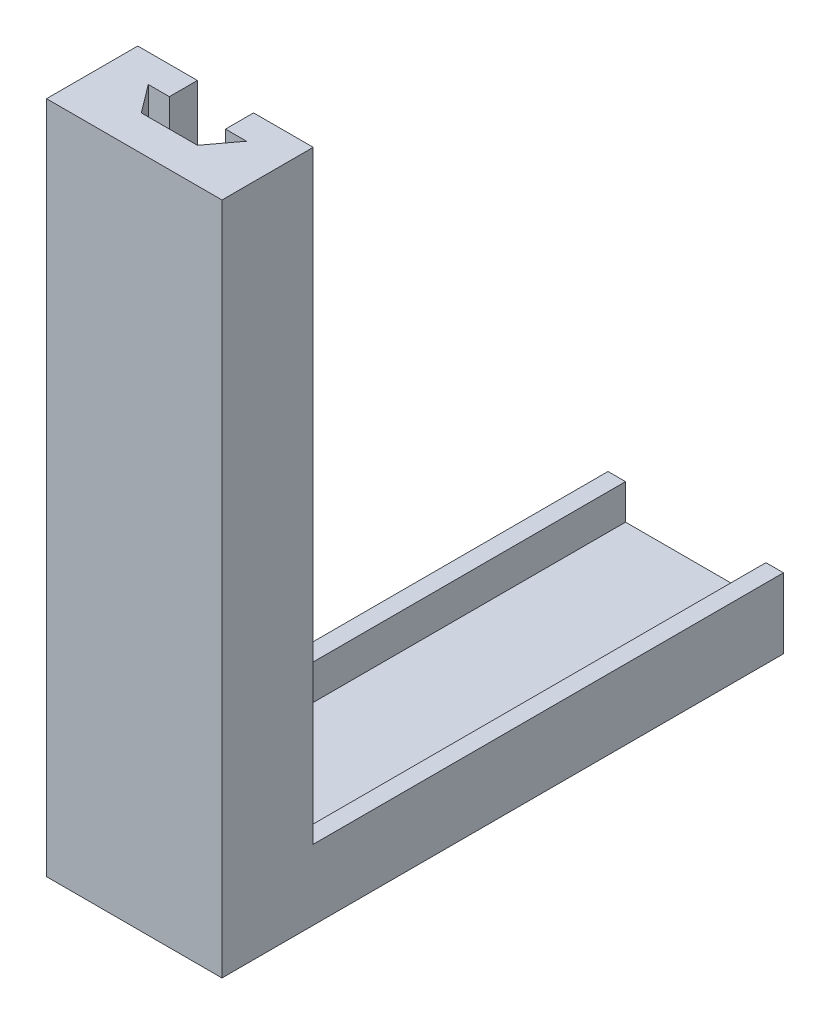
ISO-10303-21;
HEADER;
FILE_DESCRIPTION(('STEP AP214'),'2;1');
FILE_NAME('part.step','',(''),(''),'','','');
FILE_SCHEMA(('AUTOMOTIVE_DESIGN { 1 0 10303 214 1 1 1 1 }'));
ENDSEC;
DATA;
#1=APPLICATION_CONTEXT('core data for automotive mechanical design processes');
#2=APPLICATION_PROTOCOL_DEFINITION('international standard','automotive_design',2000,#1);
#3=PRODUCT_CONTEXT('',#1,'mechanical');
#4=PRODUCT('Part','Part','',(#3));
#5=PRODUCT_RELATED_PRODUCT_CATEGORY('part','',(#4));
#6=PRODUCT_DEFINITION_FORMATION('','',#4);
#7=PRODUCT_DEFINITION_CONTEXT('part definition',#1,'design');
#8=PRODUCT_DEFINITION('design','',#6,#7);
#9=PRODUCT_DEFINITION_SHAPE('','',#8);
#10=(LENGTH_UNIT() NAMED_UNIT(*) SI_UNIT(.MILLI.,.METRE.));
#11=(NAMED_UNIT(*) PLANE_ANGLE_UNIT() SI_UNIT($,.RADIAN.));
#12=(NAMED_UNIT(*) SI_UNIT($,.STERADIAN.) SOLID_ANGLE_UNIT());
#13=UNCERTAINTY_MEASURE_WITH_UNIT(LENGTH_MEASURE(1.E-05),#10,'distance_accuracy_value','');
#14=(GEOMETRIC_REPRESENTATION_CONTEXT(3) GLOBAL_UNCERTAINTY_ASSIGNED_CONTEXT((#13)) GLOBAL_UNIT_ASSIGNED_CONTEXT((#10,
#11,#12)) REPRESENTATION_CONTEXT('',''));
#15=CARTESIAN_POINT('',(0.,0.,0.));
#16=DIRECTION('',(0.,0.,1.));
#17=DIRECTION('',(1.,0.,0.));
#18=AXIS2_PLACEMENT_3D('',#15,#16,#17);
#19=CARTESIAN_POINT('',(0.,10.,0.));
#20=DIRECTION('',(0.,-1.,0.));
#21=DIRECTION('',(0.,0.,-1.));
#22=AXIS2_PLACEMENT_3D('',#19,#20,#21);
#23=PLANE('',#22);
#24=DIRECTION('',(1.,0.,0.));
#25=VECTOR('',#24,1.);
#26=CARTESIAN_POINT('',(-12.5,10.,27.));
#27=LINE('',#26,#25);
#28=CARTESIAN_POINT('',(-12.5,10.,27.));
#29=VERTEX_POINT('',#28);
#30=CARTESIAN_POINT('',(-9.99999999999999,10.,27.));
#31=VERTEX_POINT('',#30);
#32=EDGE_CURVE('E305',#29,#31,#27,.T.);
#33=ORIENTED_EDGE('',*,*,#32,.T.);
#34=DIRECTION('',(0.,0.,1.));
#35=VECTOR('',#34,1.);
#36=CARTESIAN_POINT('',(-10.,10.,-40.));
#37=LINE('',#36,#35);
#38=CARTESIAN_POINT('',(-10.,10.,-40.));
#39=VERTEX_POINT('',#38);
#40=EDGE_CURVE('E178',#39,#31,#37,.T.);
#41=ORIENTED_EDGE('',*,*,#40,.F.);
#42=DIRECTION('',(-1.,0.,0.));
#43=VECTOR('',#42,1.);
#44=CARTESIAN_POINT('',(-12.5,10.,-40.));
#45=LINE('',#44,#43);
#46=CARTESIAN_POINT('',(-12.5,10.,-40.));
#47=VERTEX_POINT('',#46);
#48=EDGE_CURVE('E329',#39,#47,#45,.T.);
#49=ORIENTED_EDGE('',*,*,#48,.T.);
#50=DIRECTION('',(0.,0.,1.));
#51=VECTOR('',#50,1.);
#52=CARTESIAN_POINT('',(-12.5,10.,40.));
#53=LINE('',#52,#51);
#54=EDGE_CURVE('E335',#47,#29,#53,.T.);
#55=ORIENTED_EDGE('',*,*,#54,.T.);
#56=EDGE_LOOP('',(#33,#41,#49,#55));
#57=FACE_BOUND('',#56,.T.);
#58=ADVANCED_FACE('F45',(#57),#23,.F.);
#59=CARTESIAN_POINT('',(-12.5,96.,27.));
#60=DIRECTION('',(0.,0.,-1.));
#61=DIRECTION('',(-1.,0.,0.));
#62=AXIS2_PLACEMENT_3D('',#59,#60,#61);
#63=PLANE('',#62);
#64=DIRECTION('',(1.,0.,0.));
#65=VECTOR('',#64,1.);
#66=CARTESIAN_POINT('',(-12.5,96.,27.));
#67=LINE('',#66,#65);
#68=CARTESIAN_POINT('',(-12.5,96.,27.));
#69=VERTEX_POINT('',#68);
#70=CARTESIAN_POINT('',(-4.,96.,27.));
#71=VERTEX_POINT('',#70);
#72=EDGE_CURVE('E306',#69,#71,#67,.T.);
#73=ORIENTED_EDGE('',*,*,#72,.T.);
#74=DIRECTION('',(0.,1.,0.));
#75=VECTOR('',#74,1.);
#76=CARTESIAN_POINT('',(-4.,4.99999999999999,27.));
#77=LINE('',#76,#75);
#78=CARTESIAN_POINT('',(-4.,4.99999999999999,27.));
#79=VERTEX_POINT('',#78);
#80=EDGE_CURVE('E190',#79,#71,#77,.T.);
#81=ORIENTED_EDGE('',*,*,#80,.F.);
#82=DIRECTION('',(1.,0.,0.));
#83=VECTOR('',#82,1.);
#84=CARTESIAN_POINT('',(-9.99999999999999,5.,27.));
#85=LINE('',#84,#83);
#86=CARTESIAN_POINT('',(-9.99999999999999,5.,27.));
#87=VERTEX_POINT('',#86);
#88=EDGE_CURVE('E187',#87,#79,#85,.T.);
#89=ORIENTED_EDGE('',*,*,#88,.F.);
#90=DIRECTION('',(0.,1.,0.));
#91=VECTOR('',#90,1.);
#92=CARTESIAN_POINT('',(-9.99999999999999,5.,27.));
#93=LINE('',#92,#91);
#94=EDGE_CURVE('E171',#87,#31,#93,.T.);
#95=ORIENTED_EDGE('',*,*,#94,.T.);
#96=ORIENTED_EDGE('',*,*,#32,.F.);
#97=DIRECTION('',(0.,-1.,0.));
#98=VECTOR('',#97,1.);
#99=CARTESIAN_POINT('',(-12.5,96.,27.));
#100=LINE('',#99,#98);
#101=EDGE_CURVE('E317',#69,#29,#100,.T.);
#102=ORIENTED_EDGE('',*,*,#101,.F.);
#103=EDGE_LOOP('',(#73,#81,#89,#95,#96,#102));
#104=FACE_BOUND('',#103,.T.);
#105=ADVANCED_FACE('F189',(#104),#63,.T.);
#106=CARTESIAN_POINT('',(12.5,10.,40.));
#107=DIRECTION('',(-1.,0.,0.));
#108=DIRECTION('',(0.,0.,1.));
#109=AXIS2_PLACEMENT_3D('',#106,#107,#108);
#110=PLANE('',#109);
#111=DIRECTION('',(0.,0.,-1.));
#112=VECTOR('',#111,1.);
#113=CARTESIAN_POINT('',(12.5,0.,40.));
#114=LINE('',#113,#112);
#115=CARTESIAN_POINT('',(12.5,0.,40.));
#116=VERTEX_POINT('',#115);
#117=CARTESIAN_POINT('',(12.5,0.,-40.));
#118=VERTEX_POINT('',#117);
#119=EDGE_CURVE('E323',#116,#118,#114,.T.);
#120=ORIENTED_EDGE('',*,*,#119,.T.);
#121=DIRECTION('',(0.,-1.,0.));
#122=VECTOR('',#121,1.);
#123=CARTESIAN_POINT('',(12.5,10.,-40.));
#124=LINE('',#123,#122);
#125=CARTESIAN_POINT('',(12.5,10.,-40.));
#126=VERTEX_POINT('',#125);
#127=EDGE_CURVE('E11',#126,#118,#124,.T.);
#128=ORIENTED_EDGE('',*,*,#127,.F.);
#129=DIRECTION('',(0.,0.,-1.));
#130=VECTOR('',#129,1.);
#131=CARTESIAN_POINT('',(12.5,10.,40.));
#132=LINE('',#131,#130);
#133=CARTESIAN_POINT('',(12.5,10.,27.));
#134=VERTEX_POINT('',#133);
#135=EDGE_CURVE('E326',#134,#126,#132,.T.);
#136=ORIENTED_EDGE('',*,*,#135,.F.);
#137=DIRECTION('',(0.,-1.,0.));
#138=VECTOR('',#137,1.);
#139=CARTESIAN_POINT('',(12.5,96.,27.));
#140=LINE('',#139,#138);
#141=CARTESIAN_POINT('',(12.5,96.,27.));
#142=VERTEX_POINT('',#141);
#143=EDGE_CURVE('E320',#142,#134,#140,.T.);
#144=ORIENTED_EDGE('',*,*,#143,.F.);
#145=DIRECTION('',(0.,0.,-1.));
#146=VECTOR('',#145,1.);
#147=CARTESIAN_POINT('',(12.5,96.,40.));
#148=LINE('',#147,#146);
#149=CARTESIAN_POINT('',(12.5,96.,40.));
#150=VERTEX_POINT('',#149);
#151=EDGE_CURVE('E309',#150,#142,#148,.T.);
#152=ORIENTED_EDGE('',*,*,#151,.F.);
#153=DIRECTION('',(0.,-1.,0.));
#154=VECTOR('',#153,1.);
#155=CARTESIAN_POINT('',(12.5,10.,40.));
#156=LINE('',#155,#154);
#157=EDGE_CURVE('E339',#150,#116,#156,.T.);
#158=ORIENTED_EDGE('',*,*,#157,.T.);
#159=EDGE_LOOP('',(#120,#128,#136,#144,#152,#158));
#160=FACE_BOUND('',#159,.T.);
#161=ADVANCED_FACE('F47',(#160),#110,.F.);
#162=CARTESIAN_POINT('',(-12.5,10.,-40.));
#163=DIRECTION('',(0.,0.,1.));
#164=DIRECTION('',(1.,0.,0.));
#165=AXIS2_PLACEMENT_3D('',#162,#163,#164);
#166=PLANE('',#165);
#167=ORIENTED_EDGE('',*,*,#48,.F.);
#168=DIRECTION('',(0.,1.,0.));
#169=VECTOR('',#168,1.);
#170=CARTESIAN_POINT('',(-10.,5.,-40.));
#171=LINE('',#170,#169);
#172=CARTESIAN_POINT('',(-10.,5.,-40.));
#173=VERTEX_POINT('',#172);
#174=EDGE_CURVE('E215',#173,#39,#171,.T.);
#175=ORIENTED_EDGE('',*,*,#174,.F.);
#176=DIRECTION('',(-1.,0.,0.));
#177=VECTOR('',#176,1.);
#178=CARTESIAN_POINT('',(-10.,5.,-40.));
#179=LINE('',#178,#177);
#180=CARTESIAN_POINT('',(10.,5.,-40.));
#181=VERTEX_POINT('',#180);
#182=EDGE_CURVE('E184',#181,#173,#179,.T.);
#183=ORIENTED_EDGE('',*,*,#182,.F.);
#184=DIRECTION('',(0.,1.,0.));
#185=VECTOR('',#184,1.);
#186=CARTESIAN_POINT('',(10.,5.,-40.));
#187=LINE('',#186,#185);
#188=CARTESIAN_POINT('',(10.,10.,-40.));
#189=VERTEX_POINT('',#188);
#190=EDGE_CURVE('E218',#181,#189,#187,.T.);
#191=ORIENTED_EDGE('',*,*,#190,.T.);
#192=EDGE_CURVE('E331',#126,#189,#45,.T.);
#193=ORIENTED_EDGE('',*,*,#192,.F.);
#194=ORIENTED_EDGE('',*,*,#127,.T.);
#195=DIRECTION('',(-1.,0.,0.));
#196=VECTOR('',#195,1.);
#197=CARTESIAN_POINT('',(-12.5,0.,-40.));
#198=LINE('',#197,#196);
#199=CARTESIAN_POINT('',(-12.5,0.,-40.));
#200=VERTEX_POINT('',#199);
#201=EDGE_CURVE('E343',#118,#200,#198,.T.);
#202=ORIENTED_EDGE('',*,*,#201,.T.);
#203=DIRECTION('',(0.,-1.,0.));
#204=VECTOR('',#203,1.);
#205=CARTESIAN_POINT('',(-12.5,10.,-40.));
#206=LINE('',#205,#204);
#207=EDGE_CURVE('E54',#47,#200,#206,.T.);
#208=ORIENTED_EDGE('',*,*,#207,.F.);
#209=EDGE_LOOP('',(#167,#175,#183,#191,#193,#194,#202,#208));
#210=FACE_BOUND('',#209,.T.);
#211=ADVANCED_FACE('F420',(#210),#166,.F.);
#212=CARTESIAN_POINT('',(-12.5,10.,40.));
#213=DIRECTION('',(1.,0.,0.));
#214=DIRECTION('',(0.,0.,-1.));
#215=AXIS2_PLACEMENT_3D('',#212,#213,#214);
#216=PLANE('',#215);
#217=DIRECTION('',(0.,0.,1.));
#218=VECTOR('',#217,1.);
#219=CARTESIAN_POINT('',(-12.5,0.,40.));
#220=LINE('',#219,#218);
#221=CARTESIAN_POINT('',(-12.5,0.,40.));
#222=VERTEX_POINT('',#221);
#223=EDGE_CURVE('E346',#200,#222,#220,.T.);
#224=ORIENTED_EDGE('',*,*,#223,.T.);
#225=DIRECTION('',(0.,-1.,0.));
#226=VECTOR('',#225,1.);
#227=CARTESIAN_POINT('',(-12.5,10.,40.));
#228=LINE('',#227,#226);
#229=CARTESIAN_POINT('',(-12.5,96.,40.));
#230=VERTEX_POINT('',#229);
#231=EDGE_CURVE('E354',#230,#222,#228,.T.);
#232=ORIENTED_EDGE('',*,*,#231,.F.);
#233=DIRECTION('',(0.,0.,-1.));
#234=VECTOR('',#233,1.);
#235=CARTESIAN_POINT('',(-12.5,96.,40.));
#236=LINE('',#235,#234);
#237=EDGE_CURVE('E300',#230,#69,#236,.T.);
#238=ORIENTED_EDGE('',*,*,#237,.T.);
#239=ORIENTED_EDGE('',*,*,#101,.T.);
#240=ORIENTED_EDGE('',*,*,#54,.F.);
#241=ORIENTED_EDGE('',*,*,#207,.T.);
#242=EDGE_LOOP('',(#224,#232,#238,#239,#240,#241));
#243=FACE_BOUND('',#242,.T.);
#244=ADVANCED_FACE('F363',(#243),#216,.F.);
#245=CARTESIAN_POINT('',(-12.5,10.,40.));
#246=DIRECTION('',(0.,0.,-1.));
#247=DIRECTION('',(-1.,0.,0.));
#248=AXIS2_PLACEMENT_3D('',#245,#246,#247);
#249=PLANE('',#248);
#250=DIRECTION('',(1.,0.,0.));
#251=VECTOR('',#250,1.);
#252=CARTESIAN_POINT('',(-12.5,0.,40.));
#253=LINE('',#252,#251);
#254=EDGE_CURVE('E330',#222,#116,#253,.T.);
#255=ORIENTED_EDGE('',*,*,#254,.T.);
#256=ORIENTED_EDGE('',*,*,#157,.F.);
#257=DIRECTION('',(1.,0.,0.));
#258=VECTOR('',#257,1.);
#259=CARTESIAN_POINT('',(-12.5,96.,40.));
#260=LINE('',#259,#258);
#261=EDGE_CURVE('E313',#230,#150,#260,.T.);
#262=ORIENTED_EDGE('',*,*,#261,.F.);
#263=ORIENTED_EDGE('',*,*,#231,.T.);
#264=EDGE_LOOP('',(#255,#256,#262,#263));
#265=FACE_BOUND('',#264,.T.);
#266=ADVANCED_FACE('F371',(#265),#249,.F.);
#267=ORIENTED_EDGE('',*,*,#192,.T.);
#268=DIRECTION('',(0.,0.,-1.));
#269=VECTOR('',#268,1.);
#270=CARTESIAN_POINT('',(10.,10.,-40.));
#271=LINE('',#270,#269);
#272=CARTESIAN_POINT('',(10.,10.,27.));
#273=VERTEX_POINT('',#272);
#274=EDGE_CURVE('E203',#273,#189,#271,.T.);
#275=ORIENTED_EDGE('',*,*,#274,.F.);
#276=EDGE_CURVE('E69',#273,#134,#27,.T.);
#277=ORIENTED_EDGE('',*,*,#276,.T.);
#278=ORIENTED_EDGE('',*,*,#135,.T.);
#279=EDGE_LOOP('',(#267,#275,#277,#278));
#280=FACE_BOUND('',#279,.T.);
#281=ADVANCED_FACE('F421',(#280),#23,.F.);
#282=CARTESIAN_POINT('',(0.,0.,0.));
#283=DIRECTION('',(0.,-1.,0.));
#284=DIRECTION('',(0.,0.,-1.));
#285=AXIS2_PLACEMENT_3D('',#282,#283,#284);
#286=PLANE('',#285);
#287=ORIENTED_EDGE('',*,*,#119,.F.);
#288=ORIENTED_EDGE('',*,*,#254,.F.);
#289=ORIENTED_EDGE('',*,*,#223,.F.);
#290=ORIENTED_EDGE('',*,*,#201,.F.);
#291=EDGE_LOOP('',(#287,#288,#289,#290));
#292=FACE_BOUND('',#291,.T.);
#293=ADVANCED_FACE('F369',(#292),#286,.T.);
#294=DIRECTION('',(0.,1.,0.));
#295=VECTOR('',#294,1.);
#296=CARTESIAN_POINT('',(4.,4.99999999999999,27.));
#297=LINE('',#296,#295);
#298=CARTESIAN_POINT('',(4.,5.,27.));
#299=VERTEX_POINT('',#298);
#300=CARTESIAN_POINT('',(4.,96.,27.));
#301=VERTEX_POINT('',#300);
#302=EDGE_CURVE('E280',#299,#301,#297,.T.);
#303=ORIENTED_EDGE('',*,*,#302,.T.);
#304=EDGE_CURVE('E304',#301,#142,#67,.T.);
#305=ORIENTED_EDGE('',*,*,#304,.T.);
#306=ORIENTED_EDGE('',*,*,#143,.T.);
#307=ORIENTED_EDGE('',*,*,#276,.F.);
#308=DIRECTION('',(0.,1.,0.));
#309=VECTOR('',#308,1.);
#310=CARTESIAN_POINT('',(10.,5.,27.));
#311=LINE('',#310,#309);
#312=CARTESIAN_POINT('',(10.,5.,27.));
#313=VERTEX_POINT('',#312);
#314=EDGE_CURVE('E183',#313,#273,#311,.T.);
#315=ORIENTED_EDGE('',*,*,#314,.F.);
#316=EDGE_CURVE('E196',#299,#313,#85,.T.);
#317=ORIENTED_EDGE('',*,*,#316,.F.);
#318=EDGE_LOOP('',(#303,#305,#306,#307,#315,#317));
#319=FACE_BOUND('',#318,.T.);
#320=ADVANCED_FACE('F390',(#319),#63,.T.);
#321=CARTESIAN_POINT('',(0.,96.,0.));
#322=DIRECTION('',(0.,-1.,0.));
#323=DIRECTION('',(0.,0.,-1.));
#324=AXIS2_PLACEMENT_3D('',#321,#322,#323);
#325=PLANE('',#324);
#326=DIRECTION('',(-1.,0.,0.));
#327=VECTOR('',#326,1.);
#328=CARTESIAN_POINT('',(-4.,96.,31.));
#329=LINE('',#328,#327);
#330=CARTESIAN_POINT('',(-4.,96.,31.));
#331=VERTEX_POINT('',#330);
#332=CARTESIAN_POINT('',(-7.,96.,31.));
#333=VERTEX_POINT('',#332);
#334=EDGE_CURVE('E255',#331,#333,#329,.T.);
#335=ORIENTED_EDGE('',*,*,#334,.F.);
#336=DIRECTION('',(0.,0.,1.));
#337=VECTOR('',#336,1.);
#338=CARTESIAN_POINT('',(-4.,96.,27.));
#339=LINE('',#338,#337);
#340=EDGE_CURVE('E61',#71,#331,#339,.T.);
#341=ORIENTED_EDGE('',*,*,#340,.F.);
#342=ORIENTED_EDGE('',*,*,#72,.F.);
#343=ORIENTED_EDGE('',*,*,#237,.F.);
#344=ORIENTED_EDGE('',*,*,#261,.T.);
#345=ORIENTED_EDGE('',*,*,#151,.T.);
#346=ORIENTED_EDGE('',*,*,#304,.F.);
#347=DIRECTION('',(0.,0.,-1.));
#348=VECTOR('',#347,1.);
#349=CARTESIAN_POINT('',(4.,96.,31.));
#350=LINE('',#349,#348);
#351=CARTESIAN_POINT('',(4.,96.,31.));
#352=VERTEX_POINT('',#351);
#353=EDGE_CURVE('E228',#352,#301,#350,.T.);
#354=ORIENTED_EDGE('',*,*,#353,.F.);
#355=DIRECTION('',(-1.,0.,0.));
#356=VECTOR('',#355,1.);
#357=CARTESIAN_POINT('',(7.,96.,31.));
#358=LINE('',#357,#356);
#359=CARTESIAN_POINT('',(7.,96.,31.));
#360=VERTEX_POINT('',#359);
#361=EDGE_CURVE('E271',#360,#352,#358,.T.);
#362=ORIENTED_EDGE('',*,*,#361,.F.);
#363=DIRECTION('',(0.6,0.,-0.8));
#364=VECTOR('',#363,1.);
#365=CARTESIAN_POINT('',(4.,96.,35.));
#366=LINE('',#365,#364);
#367=CARTESIAN_POINT('',(4.,96.,35.));
#368=VERTEX_POINT('',#367);
#369=EDGE_CURVE('E267',#368,#360,#366,.T.);
#370=ORIENTED_EDGE('',*,*,#369,.F.);
#371=DIRECTION('',(1.,0.,0.));
#372=VECTOR('',#371,1.);
#373=CARTESIAN_POINT('',(-4.,96.,35.));
#374=LINE('',#373,#372);
#375=CARTESIAN_POINT('',(-4.,96.,35.));
#376=VERTEX_POINT('',#375);
#377=EDGE_CURVE('E263',#376,#368,#374,.T.);
#378=ORIENTED_EDGE('',*,*,#377,.F.);
#379=DIRECTION('',(0.6,0.,0.8));
#380=VECTOR('',#379,1.);
#381=CARTESIAN_POINT('',(-7.,96.,31.));
#382=LINE('',#381,#380);
#383=EDGE_CURVE('E259',#333,#376,#382,.T.);
#384=ORIENTED_EDGE('',*,*,#383,.F.);
#385=EDGE_LOOP('',(#335,#341,#342,#343,#344,#345,#346,#354,#362,#370,#378,#384));
#386=FACE_BOUND('',#385,.T.);
#387=ADVANCED_FACE('F381',(#386),#325,.F.);
#388=CARTESIAN_POINT('',(-4.,4.99999999999999,27.));
#389=DIRECTION('',(-1.,0.,0.));
#390=DIRECTION('',(0.,0.,1.));
#391=AXIS2_PLACEMENT_3D('',#388,#389,#390);
#392=PLANE('',#391);
#393=ORIENTED_EDGE('',*,*,#340,.T.);
#394=DIRECTION('',(0.,1.,0.));
#395=VECTOR('',#394,1.);
#396=CARTESIAN_POINT('',(-4.,4.99999999999999,31.));
#397=LINE('',#396,#395);
#398=CARTESIAN_POINT('',(-4.,4.99999999999999,31.));
#399=VERTEX_POINT('',#398);
#400=EDGE_CURVE('E252',#399,#331,#397,.T.);
#401=ORIENTED_EDGE('',*,*,#400,.F.);
#402=DIRECTION('',(0.,0.,1.));
#403=VECTOR('',#402,1.);
#404=CARTESIAN_POINT('',(-4.,4.99999999999999,27.));
#405=LINE('',#404,#403);
#406=EDGE_CURVE('E224',#79,#399,#405,.T.);
#407=ORIENTED_EDGE('',*,*,#406,.F.);
#408=ORIENTED_EDGE('',*,*,#80,.T.);
#409=EDGE_LOOP('',(#393,#401,#407,#408));
#410=FACE_BOUND('',#409,.T.);
#411=ADVANCED_FACE('F415',(#410),#392,.F.);
#412=CARTESIAN_POINT('',(4.,4.99999999999999,31.));
#413=DIRECTION('',(1.,0.,0.));
#414=DIRECTION('',(0.,0.,-1.));
#415=AXIS2_PLACEMENT_3D('',#412,#413,#414);
#416=PLANE('',#415);
#417=ORIENTED_EDGE('',*,*,#353,.T.);
#418=ORIENTED_EDGE('',*,*,#302,.F.);
#419=DIRECTION('',(0.,0.,-1.));
#420=VECTOR('',#419,1.);
#421=CARTESIAN_POINT('',(4.,4.99999999999999,31.));
#422=LINE('',#421,#420);
#423=CARTESIAN_POINT('',(4.,4.99999999999999,31.));
#424=VERTEX_POINT('',#423);
#425=EDGE_CURVE('E248',#424,#299,#422,.T.);
#426=ORIENTED_EDGE('',*,*,#425,.F.);
#427=DIRECTION('',(0.,1.,0.));
#428=VECTOR('',#427,1.);
#429=CARTESIAN_POINT('',(4.,4.99999999999999,31.));
#430=LINE('',#429,#428);
#431=EDGE_CURVE('E283',#424,#352,#430,.T.);
#432=ORIENTED_EDGE('',*,*,#431,.T.);
#433=EDGE_LOOP('',(#417,#418,#426,#432));
#434=FACE_BOUND('',#433,.T.);
#435=ADVANCED_FACE('F395',(#434),#416,.F.);
#436=CARTESIAN_POINT('',(7.,4.99999999999999,31.));
#437=DIRECTION('',(0.,0.,-1.));
#438=DIRECTION('',(-1.,0.,0.));
#439=AXIS2_PLACEMENT_3D('',#436,#437,#438);
#440=PLANE('',#439);
#441=ORIENTED_EDGE('',*,*,#361,.T.);
#442=ORIENTED_EDGE('',*,*,#431,.F.);
#443=DIRECTION('',(-1.,0.,0.));
#444=VECTOR('',#443,1.);
#445=CARTESIAN_POINT('',(7.,4.99999999999999,31.));
#446=LINE('',#445,#444);
#447=CARTESIAN_POINT('',(7.,4.99999999999999,31.));
#448=VERTEX_POINT('',#447);
#449=EDGE_CURVE('E244',#448,#424,#446,.T.);
#450=ORIENTED_EDGE('',*,*,#449,.F.);
#451=DIRECTION('',(0.,1.,0.));
#452=VECTOR('',#451,1.);
#453=CARTESIAN_POINT('',(7.,4.99999999999999,31.));
#454=LINE('',#453,#452);
#455=EDGE_CURVE('E286',#448,#360,#454,.T.);
#456=ORIENTED_EDGE('',*,*,#455,.T.);
#457=EDGE_LOOP('',(#441,#442,#450,#456));
#458=FACE_BOUND('',#457,.T.);
#459=ADVANCED_FACE('F400',(#458),#440,.F.);
#460=CARTESIAN_POINT('',(4.,4.99999999999999,35.));
#461=DIRECTION('',(0.8,0.,0.6));
#462=DIRECTION('',(0.6,0.,-0.8));
#463=AXIS2_PLACEMENT_3D('',#460,#461,#462);
#464=PLANE('',#463);
#465=ORIENTED_EDGE('',*,*,#369,.T.);
#466=ORIENTED_EDGE('',*,*,#455,.F.);
#467=DIRECTION('',(0.6,0.,-0.8));
#468=VECTOR('',#467,1.);
#469=CARTESIAN_POINT('',(4.,4.99999999999999,35.));
#470=LINE('',#469,#468);
#471=CARTESIAN_POINT('',(4.,4.99999999999999,35.));
#472=VERTEX_POINT('',#471);
#473=EDGE_CURVE('E240',#472,#448,#470,.T.);
#474=ORIENTED_EDGE('',*,*,#473,.F.);
#475=DIRECTION('',(0.,1.,0.));
#476=VECTOR('',#475,1.);
#477=CARTESIAN_POINT('',(4.,4.99999999999999,35.));
#478=LINE('',#477,#476);
#479=EDGE_CURVE('E289',#472,#368,#478,.T.);
#480=ORIENTED_EDGE('',*,*,#479,.T.);
#481=EDGE_LOOP('',(#465,#466,#474,#480));
#482=FACE_BOUND('',#481,.T.);
#483=ADVANCED_FACE('F404',(#482),#464,.F.);
#484=CARTESIAN_POINT('',(-4.,4.99999999999999,35.));
#485=DIRECTION('',(0.,0.,1.));
#486=DIRECTION('',(1.,0.,0.));
#487=AXIS2_PLACEMENT_3D('',#484,#485,#486);
#488=PLANE('',#487);
#489=ORIENTED_EDGE('',*,*,#377,.T.);
#490=ORIENTED_EDGE('',*,*,#479,.F.);
#491=DIRECTION('',(1.,0.,0.));
#492=VECTOR('',#491,1.);
#493=CARTESIAN_POINT('',(-4.,4.99999999999999,35.));
#494=LINE('',#493,#492);
#495=CARTESIAN_POINT('',(-4.,4.99999999999999,35.));
#496=VERTEX_POINT('',#495);
#497=EDGE_CURVE('E236',#496,#472,#494,.T.);
#498=ORIENTED_EDGE('',*,*,#497,.F.);
#499=DIRECTION('',(0.,1.,0.));
#500=VECTOR('',#499,1.);
#501=CARTESIAN_POINT('',(-4.,4.99999999999999,35.));
#502=LINE('',#501,#500);
#503=EDGE_CURVE('E292',#496,#376,#502,.T.);
#504=ORIENTED_EDGE('',*,*,#503,.T.);
#505=EDGE_LOOP('',(#489,#490,#498,#504));
#506=FACE_BOUND('',#505,.T.);
#507=ADVANCED_FACE('F407',(#506),#488,.F.);
#508=CARTESIAN_POINT('',(-7.,4.99999999999999,31.));
#509=DIRECTION('',(-0.8,0.,0.6));
#510=DIRECTION('',(0.6,0.,0.8));
#511=AXIS2_PLACEMENT_3D('',#508,#509,#510);
#512=PLANE('',#511);
#513=ORIENTED_EDGE('',*,*,#383,.T.);
#514=ORIENTED_EDGE('',*,*,#503,.F.);
#515=DIRECTION('',(0.6,0.,0.8));
#516=VECTOR('',#515,1.);
#517=CARTESIAN_POINT('',(-7.,4.99999999999999,31.));
#518=LINE('',#517,#516);
#519=CARTESIAN_POINT('',(-7.,4.99999999999999,31.));
#520=VERTEX_POINT('',#519);
#521=EDGE_CURVE('E232',#520,#496,#518,.T.);
#522=ORIENTED_EDGE('',*,*,#521,.F.);
#523=DIRECTION('',(0.,1.,0.));
#524=VECTOR('',#523,1.);
#525=CARTESIAN_POINT('',(-7.,4.99999999999999,31.));
#526=LINE('',#525,#524);
#527=EDGE_CURVE('E295',#520,#333,#526,.T.);
#528=ORIENTED_EDGE('',*,*,#527,.T.);
#529=EDGE_LOOP('',(#513,#514,#522,#528));
#530=FACE_BOUND('',#529,.T.);
#531=ADVANCED_FACE('F410',(#530),#512,.F.);
#532=CARTESIAN_POINT('',(-4.,4.99999999999999,31.));
#533=DIRECTION('',(0.,0.,-1.));
#534=DIRECTION('',(-1.,0.,0.));
#535=AXIS2_PLACEMENT_3D('',#532,#533,#534);
#536=PLANE('',#535);
#537=ORIENTED_EDGE('',*,*,#334,.T.);
#538=ORIENTED_EDGE('',*,*,#527,.F.);
#539=DIRECTION('',(-1.,0.,0.));
#540=VECTOR('',#539,1.);
#541=CARTESIAN_POINT('',(-4.,4.99999999999999,31.));
#542=LINE('',#541,#540);
#543=EDGE_CURVE('E227',#399,#520,#542,.T.);
#544=ORIENTED_EDGE('',*,*,#543,.F.);
#545=ORIENTED_EDGE('',*,*,#400,.T.);
#546=EDGE_LOOP('',(#537,#538,#544,#545));
#547=FACE_BOUND('',#546,.T.);
#548=ADVANCED_FACE('F414',(#547),#536,.F.);
#549=CARTESIAN_POINT('',(0.,4.99999999999999,0.));
#550=DIRECTION('',(0.,-1.,0.));
#551=DIRECTION('',(0.,0.,-1.));
#552=AXIS2_PLACEMENT_3D('',#549,#550,#551);
#553=PLANE('',#552);
#554=ORIENTED_EDGE('',*,*,#406,.T.);
#555=ORIENTED_EDGE('',*,*,#543,.T.);
#556=ORIENTED_EDGE('',*,*,#521,.T.);
#557=ORIENTED_EDGE('',*,*,#497,.T.);
#558=ORIENTED_EDGE('',*,*,#473,.T.);
#559=ORIENTED_EDGE('',*,*,#449,.T.);
#560=ORIENTED_EDGE('',*,*,#425,.T.);
#561=ORIENTED_EDGE('',*,*,#316,.T.);
#562=DIRECTION('',(0.,0.,-1.));
#563=VECTOR('',#562,1.);
#564=CARTESIAN_POINT('',(10.,5.,-40.));
#565=LINE('',#564,#563);
#566=EDGE_CURVE('E195',#313,#181,#565,.T.);
#567=ORIENTED_EDGE('',*,*,#566,.T.);
#568=ORIENTED_EDGE('',*,*,#182,.T.);
#569=DIRECTION('',(0.,0.,1.));
#570=VECTOR('',#569,1.);
#571=CARTESIAN_POINT('',(-10.,5.,-40.));
#572=LINE('',#571,#570);
#573=EDGE_CURVE('E175',#173,#87,#572,.T.);
#574=ORIENTED_EDGE('',*,*,#573,.T.);
#575=ORIENTED_EDGE('',*,*,#88,.T.);
#576=EDGE_LOOP('',(#554,#555,#556,#557,#558,#559,#560,#561,#567,#568,#574,#575));
#577=FACE_BOUND('',#576,.T.);
#578=ADVANCED_FACE('F198',(#577),#553,.F.);
#579=CARTESIAN_POINT('',(-10.,5.,-40.));
#580=DIRECTION('',(-1.,0.,0.));
#581=DIRECTION('',(0.,0.,1.));
#582=AXIS2_PLACEMENT_3D('',#579,#580,#581);
#583=PLANE('',#582);
#584=ORIENTED_EDGE('',*,*,#40,.T.);
#585=ORIENTED_EDGE('',*,*,#94,.F.);
#586=ORIENTED_EDGE('',*,*,#573,.F.);
#587=ORIENTED_EDGE('',*,*,#174,.T.);
#588=EDGE_LOOP('',(#584,#585,#586,#587));
#589=FACE_BOUND('',#588,.T.);
#590=ADVANCED_FACE('F173',(#589),#583,.F.);
#591=CARTESIAN_POINT('',(10.,5.,-40.));
#592=DIRECTION('',(1.,0.,0.));
#593=DIRECTION('',(0.,0.,-1.));
#594=AXIS2_PLACEMENT_3D('',#591,#592,#593);
#595=PLANE('',#594);
#596=ORIENTED_EDGE('',*,*,#274,.T.);
#597=ORIENTED_EDGE('',*,*,#190,.F.);
#598=ORIENTED_EDGE('',*,*,#566,.F.);
#599=ORIENTED_EDGE('',*,*,#314,.T.);
#600=EDGE_LOOP('',(#596,#597,#598,#599));
#601=FACE_BOUND('',#600,.T.);
#602=ADVANCED_FACE('F418',(#601),#595,.F.);
#603=CLOSED_SHELL('',(#58,#105,#161,#211,#244,#266,#281,#293,#320,#387,#411,#435,#459,#483,#507,
#531,#548,#578,#590,#602));
#604=MANIFOLD_SOLID_BREP('B2',#603);
#605=ADVANCED_BREP_SHAPE_REPRESENTATION('',(#18,#604),#14);
#606=SHAPE_DEFINITION_REPRESENTATION(#9,#605);
ENDSEC;
END-ISO-10303-21;
